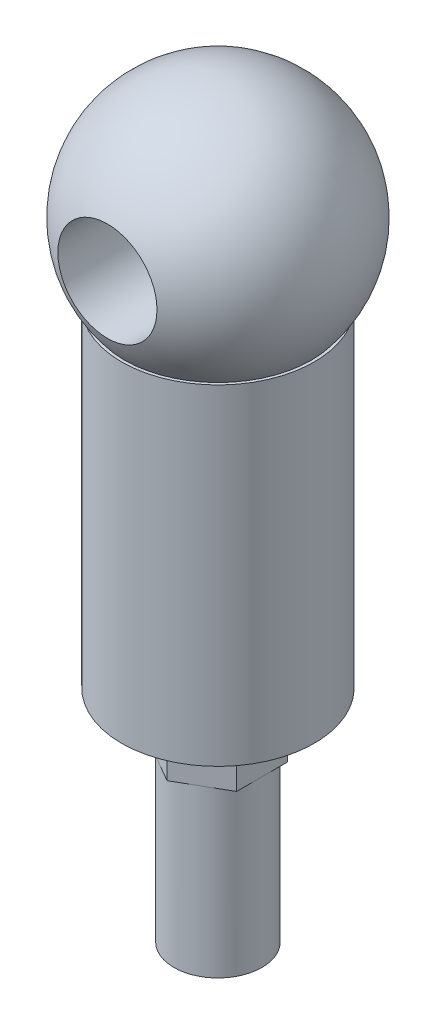
ISO-10303-21;
HEADER;
FILE_DESCRIPTION(('STEP AP214'),'2;1');
FILE_NAME('part.step','',(''),(''),'','','');
FILE_SCHEMA(('AUTOMOTIVE_DESIGN { 1 0 10303 214 1 1 1 1 }'));
ENDSEC;
DATA;
#1=APPLICATION_CONTEXT('core data for automotive mechanical design processes');
#2=APPLICATION_PROTOCOL_DEFINITION('international standard','automotive_design',2000,#1);
#3=PRODUCT_CONTEXT('',#1,'mechanical');
#4=PRODUCT('Part','Part','',(#3));
#5=PRODUCT_RELATED_PRODUCT_CATEGORY('part','',(#4));
#6=PRODUCT_DEFINITION_FORMATION('','',#4);
#7=PRODUCT_DEFINITION_CONTEXT('part definition',#1,'design');
#8=PRODUCT_DEFINITION('design','',#6,#7);
#9=PRODUCT_DEFINITION_SHAPE('','',#8);
#10=(LENGTH_UNIT() NAMED_UNIT(*) SI_UNIT(.MILLI.,.METRE.));
#11=(NAMED_UNIT(*) PLANE_ANGLE_UNIT() SI_UNIT($,.RADIAN.));
#12=(NAMED_UNIT(*) SI_UNIT($,.STERADIAN.) SOLID_ANGLE_UNIT());
#13=UNCERTAINTY_MEASURE_WITH_UNIT(LENGTH_MEASURE(1.E-05),#10,'distance_accuracy_value','');
#14=(GEOMETRIC_REPRESENTATION_CONTEXT(3) GLOBAL_UNCERTAINTY_ASSIGNED_CONTEXT((#13)) GLOBAL_UNIT_ASSIGNED_CONTEXT((#10,
#11,#12)) REPRESENTATION_CONTEXT('',''));
#15=CARTESIAN_POINT('',(0.,0.,0.));
#16=DIRECTION('',(0.,0.,1.));
#17=DIRECTION('',(1.,0.,0.));
#18=AXIS2_PLACEMENT_3D('',#15,#16,#17);
#19=CARTESIAN_POINT('',(0.,0.,0.));
#20=DIRECTION('',(0.,1.,0.));
#21=DIRECTION('',(0.,0.,1.));
#22=AXIS2_PLACEMENT_3D('',#19,#20,#21);
#23=PLANE('',#22);
#24=CARTESIAN_POINT('',(0.,0.,0.));
#25=DIRECTION('',(0.,-1.,0.));
#26=DIRECTION('',(0.,0.,-1.));
#27=AXIS2_PLACEMENT_3D('',#24,#25,#26);
#28=CIRCLE('',#27,4.);
#29=CARTESIAN_POINT('',(1.99999999999998,0.,-3.46410161513777));
#30=VERTEX_POINT('',#29);
#31=CARTESIAN_POINT('',(3.99999999999999,0.,0.));
#32=VERTEX_POINT('',#31);
#33=EDGE_CURVE('E47',#30,#32,#28,.T.);
#34=ORIENTED_EDGE('',*,*,#33,.F.);
#35=DIRECTION('',(-0.866025403784442,0.,-0.499999999999995));
#36=VECTOR('',#35,1.);
#37=CARTESIAN_POINT('',(3.99999999999997,0.,-2.30940107675855));
#38=LINE('',#37,#36);
#39=CARTESIAN_POINT('',(3.99999999999997,0.,-2.30940107675855));
#40=VERTEX_POINT('',#39);
#41=EDGE_CURVE('E113',#40,#30,#38,.T.);
#42=ORIENTED_EDGE('',*,*,#41,.F.);
#43=DIRECTION('',(0.,0.,-1.));
#44=VECTOR('',#43,1.);
#45=CARTESIAN_POINT('',(4.00000000000002,0.,2.30940107675846));
#46=LINE('',#45,#44);
#47=EDGE_CURVE('E129',#32,#40,#46,.T.);
#48=ORIENTED_EDGE('',*,*,#47,.F.);
#49=EDGE_LOOP('',(#34,#42,#48));
#50=FACE_BOUND('',#49,.T.);
#51=ADVANCED_FACE('F36',(#50),#23,.F.);
#52=CARTESIAN_POINT('',(2.00000000000003,0.,3.46410161513773));
#53=VERTEX_POINT('',#52);
#54=EDGE_CURVE('E11',#32,#53,#28,.T.);
#55=ORIENTED_EDGE('',*,*,#54,.F.);
#56=CARTESIAN_POINT('',(4.00000000000002,0.,2.30940107675846));
#57=VERTEX_POINT('',#56);
#58=EDGE_CURVE('E151',#57,#32,#46,.T.);
#59=ORIENTED_EDGE('',*,*,#58,.F.);
#60=DIRECTION('',(0.866025403784435,0.,-0.500000000000007));
#61=VECTOR('',#60,1.);
#62=CARTESIAN_POINT('',(0.,0.,4.618802153517));
#63=LINE('',#62,#61);
#64=EDGE_CURVE('E175',#53,#57,#63,.T.);
#65=ORIENTED_EDGE('',*,*,#64,.F.);
#66=EDGE_LOOP('',(#55,#59,#65));
#67=FACE_BOUND('',#66,.T.);
#68=ADVANCED_FACE('F215',(#67),#23,.F.);
#69=CARTESIAN_POINT('',(-1.99999999999998,0.,3.46410161513776));
#70=VERTEX_POINT('',#69);
#71=EDGE_CURVE('E45',#53,#70,#28,.T.);
#72=ORIENTED_EDGE('',*,*,#71,.F.);
#73=CARTESIAN_POINT('',(0.,0.,4.618802153517));
#74=VERTEX_POINT('',#73);
#75=EDGE_CURVE('E176',#74,#53,#63,.T.);
#76=ORIENTED_EDGE('',*,*,#75,.F.);
#77=DIRECTION('',(0.866025403784441,0.,0.499999999999995));
#78=VECTOR('',#77,1.);
#79=CARTESIAN_POINT('',(-3.99999999999998,0.,2.30940107675852));
#80=LINE('',#79,#78);
#81=EDGE_CURVE('E171',#70,#74,#80,.T.);
#82=ORIENTED_EDGE('',*,*,#81,.F.);
#83=EDGE_LOOP('',(#72,#76,#82));
#84=FACE_BOUND('',#83,.T.);
#85=ADVANCED_FACE('F220',(#84),#23,.F.);
#86=CARTESIAN_POINT('',(-3.99999999999999,0.,0.));
#87=VERTEX_POINT('',#86);
#88=EDGE_CURVE('E136',#70,#87,#28,.T.);
#89=ORIENTED_EDGE('',*,*,#88,.F.);
#90=CARTESIAN_POINT('',(-3.99999999999998,0.,2.30940107675852));
#91=VERTEX_POINT('',#90);
#92=EDGE_CURVE('E172',#91,#70,#80,.T.);
#93=ORIENTED_EDGE('',*,*,#92,.F.);
#94=DIRECTION('',(0.,0.,1.));
#95=VECTOR('',#94,1.);
#96=CARTESIAN_POINT('',(-4.,0.,-2.30940107675849));
#97=LINE('',#96,#95);
#98=EDGE_CURVE('E167',#87,#91,#97,.T.);
#99=ORIENTED_EDGE('',*,*,#98,.F.);
#100=EDGE_LOOP('',(#89,#93,#99));
#101=FACE_BOUND('',#100,.T.);
#102=ADVANCED_FACE('F238',(#101),#23,.F.);
#103=CARTESIAN_POINT('',(-2.,0.,-3.46410161513775));
#104=VERTEX_POINT('',#103);
#105=EDGE_CURVE('E61',#87,#104,#28,.T.);
#106=ORIENTED_EDGE('',*,*,#105,.F.);
#107=CARTESIAN_POINT('',(-4.,0.,-2.30940107675849));
#108=VERTEX_POINT('',#107);
#109=EDGE_CURVE('E168',#108,#87,#97,.T.);
#110=ORIENTED_EDGE('',*,*,#109,.F.);
#111=DIRECTION('',(-0.866025403784438,0.,0.500000000000001));
#112=VECTOR('',#111,1.);
#113=CARTESIAN_POINT('',(0.,0.,-4.618802153517));
#114=LINE('',#113,#112);
#115=EDGE_CURVE('E121',#104,#108,#114,.T.);
#116=ORIENTED_EDGE('',*,*,#115,.F.);
#117=EDGE_LOOP('',(#106,#110,#116));
#118=FACE_BOUND('',#117,.T.);
#119=ADVANCED_FACE('F227',(#118),#23,.F.);
#120=CARTESIAN_POINT('',(3.99999999999997,5.,-2.30940107675855));
#121=DIRECTION('',(-0.499999999999995,0.,0.866025403784442));
#122=DIRECTION('',(0.866025403784442,0.,0.499999999999995));
#123=AXIS2_PLACEMENT_3D('',#120,#121,#122);
#124=PLANE('',#123);
#125=ORIENTED_EDGE('',*,*,#41,.T.);
#126=CARTESIAN_POINT('',(0.,0.,-4.618802153517));
#127=VERTEX_POINT('',#126);
#128=EDGE_CURVE('E115',#30,#127,#38,.T.);
#129=ORIENTED_EDGE('',*,*,#128,.T.);
#130=DIRECTION('',(0.,-1.,0.));
#131=VECTOR('',#130,1.);
#132=CARTESIAN_POINT('',(0.,5.,-4.618802153517));
#133=LINE('',#132,#131);
#134=CARTESIAN_POINT('',(0.,5.,-4.618802153517));
#135=VERTEX_POINT('',#134);
#136=EDGE_CURVE('E135',#135,#127,#133,.T.);
#137=ORIENTED_EDGE('',*,*,#136,.F.);
#138=DIRECTION('',(-0.866025403784442,0.,-0.499999999999995));
#139=VECTOR('',#138,1.);
#140=CARTESIAN_POINT('',(3.99999999999997,5.,-2.30940107675855));
#141=LINE('',#140,#139);
#142=CARTESIAN_POINT('',(3.99999999999997,5.,-2.30940107675855));
#143=VERTEX_POINT('',#142);
#144=EDGE_CURVE('E147',#143,#135,#141,.T.);
#145=ORIENTED_EDGE('',*,*,#144,.F.);
#146=DIRECTION('',(0.,-1.,0.));
#147=VECTOR('',#146,1.);
#148=CARTESIAN_POINT('',(3.99999999999997,5.,-2.30940107675855));
#149=LINE('',#148,#147);
#150=EDGE_CURVE('E117',#143,#40,#149,.T.);
#151=ORIENTED_EDGE('',*,*,#150,.T.);
#152=EDGE_LOOP('',(#125,#129,#137,#145,#151));
#153=FACE_BOUND('',#152,.T.);
#154=ADVANCED_FACE('F38',(#153),#124,.F.);
#155=CARTESIAN_POINT('',(0.,5.,-4.618802153517));
#156=DIRECTION('',(0.500000000000001,0.,0.866025403784438));
#157=DIRECTION('',(0.866025403784438,0.,-0.500000000000001));
#158=AXIS2_PLACEMENT_3D('',#155,#156,#157);
#159=PLANE('',#158);
#160=EDGE_CURVE('E125',#127,#104,#114,.T.);
#161=ORIENTED_EDGE('',*,*,#160,.T.);
#162=ORIENTED_EDGE('',*,*,#115,.T.);
#163=DIRECTION('',(0.,-1.,0.));
#164=VECTOR('',#163,1.);
#165=CARTESIAN_POINT('',(-4.,5.,-2.30940107675849));
#166=LINE('',#165,#164);
#167=CARTESIAN_POINT('',(-4.,5.,-2.30940107675849));
#168=VERTEX_POINT('',#167);
#169=EDGE_CURVE('E137',#168,#108,#166,.T.);
#170=ORIENTED_EDGE('',*,*,#169,.F.);
#171=DIRECTION('',(-0.866025403784438,0.,0.500000000000001));
#172=VECTOR('',#171,1.);
#173=CARTESIAN_POINT('',(0.,5.,-4.618802153517));
#174=LINE('',#173,#172);
#175=EDGE_CURVE('E150',#135,#168,#174,.T.);
#176=ORIENTED_EDGE('',*,*,#175,.F.);
#177=ORIENTED_EDGE('',*,*,#136,.T.);
#178=EDGE_LOOP('',(#161,#162,#170,#176,#177));
#179=FACE_BOUND('',#178,.T.);
#180=ADVANCED_FACE('F243',(#179),#159,.F.);
#181=CARTESIAN_POINT('',(-4.,5.,-2.30940107675849));
#182=DIRECTION('',(1.,0.,0.));
#183=DIRECTION('',(0.,0.,-1.));
#184=AXIS2_PLACEMENT_3D('',#181,#182,#183);
#185=PLANE('',#184);
#186=ORIENTED_EDGE('',*,*,#109,.T.);
#187=ORIENTED_EDGE('',*,*,#98,.T.);
#188=DIRECTION('',(0.,-1.,0.));
#189=VECTOR('',#188,1.);
#190=CARTESIAN_POINT('',(-3.99999999999998,5.,2.30940107675852));
#191=LINE('',#190,#189);
#192=CARTESIAN_POINT('',(-3.99999999999998,5.,2.30940107675852));
#193=VERTEX_POINT('',#192);
#194=EDGE_CURVE('E187',#193,#91,#191,.T.);
#195=ORIENTED_EDGE('',*,*,#194,.F.);
#196=DIRECTION('',(0.,0.,1.));
#197=VECTOR('',#196,1.);
#198=CARTESIAN_POINT('',(-4.,5.,-2.30940107675849));
#199=LINE('',#198,#197);
#200=EDGE_CURVE('E154',#168,#193,#199,.T.);
#201=ORIENTED_EDGE('',*,*,#200,.F.);
#202=ORIENTED_EDGE('',*,*,#169,.T.);
#203=EDGE_LOOP('',(#186,#187,#195,#201,#202));
#204=FACE_BOUND('',#203,.T.);
#205=ADVANCED_FACE('F263',(#204),#185,.F.);
#206=CARTESIAN_POINT('',(-3.99999999999998,5.,2.30940107675852));
#207=DIRECTION('',(0.499999999999995,0.,-0.866025403784442));
#208=DIRECTION('',(-0.866025403784442,0.,-0.499999999999995));
#209=AXIS2_PLACEMENT_3D('',#206,#207,#208);
#210=PLANE('',#209);
#211=ORIENTED_EDGE('',*,*,#92,.T.);
#212=ORIENTED_EDGE('',*,*,#81,.T.);
#213=DIRECTION('',(0.,-1.,0.));
#214=VECTOR('',#213,1.);
#215=CARTESIAN_POINT('',(0.,5.,4.618802153517));
#216=LINE('',#215,#214);
#217=CARTESIAN_POINT('',(0.,5.,4.618802153517));
#218=VERTEX_POINT('',#217);
#219=EDGE_CURVE('E184',#218,#74,#216,.T.);
#220=ORIENTED_EDGE('',*,*,#219,.F.);
#221=DIRECTION('',(0.866025403784441,0.,0.499999999999995));
#222=VECTOR('',#221,1.);
#223=CARTESIAN_POINT('',(-3.99999999999998,5.,2.30940107675852));
#224=LINE('',#223,#222);
#225=EDGE_CURVE('E157',#193,#218,#224,.T.);
#226=ORIENTED_EDGE('',*,*,#225,.F.);
#227=ORIENTED_EDGE('',*,*,#194,.T.);
#228=EDGE_LOOP('',(#211,#212,#220,#226,#227));
#229=FACE_BOUND('',#228,.T.);
#230=ADVANCED_FACE('F255',(#229),#210,.F.);
#231=CARTESIAN_POINT('',(0.,5.,4.618802153517));
#232=DIRECTION('',(-0.500000000000007,0.,-0.866025403784434));
#233=DIRECTION('',(-0.866025403784435,0.,0.500000000000007));
#234=AXIS2_PLACEMENT_3D('',#231,#232,#233);
#235=PLANE('',#234);
#236=ORIENTED_EDGE('',*,*,#75,.T.);
#237=ORIENTED_EDGE('',*,*,#64,.T.);
#238=DIRECTION('',(0.,-1.,0.));
#239=VECTOR('',#238,1.);
#240=CARTESIAN_POINT('',(4.00000000000002,5.,2.30940107675846));
#241=LINE('',#240,#239);
#242=CARTESIAN_POINT('',(4.00000000000002,5.,2.30940107675846));
#243=VERTEX_POINT('',#242);
#244=EDGE_CURVE('E181',#243,#57,#241,.T.);
#245=ORIENTED_EDGE('',*,*,#244,.F.);
#246=DIRECTION('',(0.866025403784435,0.,-0.500000000000007));
#247=VECTOR('',#246,1.);
#248=CARTESIAN_POINT('',(0.,5.,4.618802153517));
#249=LINE('',#248,#247);
#250=EDGE_CURVE('E160',#218,#243,#249,.T.);
#251=ORIENTED_EDGE('',*,*,#250,.F.);
#252=ORIENTED_EDGE('',*,*,#219,.T.);
#253=EDGE_LOOP('',(#236,#237,#245,#251,#252));
#254=FACE_BOUND('',#253,.T.);
#255=ADVANCED_FACE('F235',(#254),#235,.F.);
#256=CARTESIAN_POINT('',(4.00000000000002,5.,2.30940107675846));
#257=DIRECTION('',(-1.,0.,0.));
#258=DIRECTION('',(0.,0.,1.));
#259=AXIS2_PLACEMENT_3D('',#256,#257,#258);
#260=PLANE('',#259);
#261=ORIENTED_EDGE('',*,*,#58,.T.);
#262=ORIENTED_EDGE('',*,*,#47,.T.);
#263=ORIENTED_EDGE('',*,*,#150,.F.);
#264=DIRECTION('',(0.,0.,-1.));
#265=VECTOR('',#264,1.);
#266=CARTESIAN_POINT('',(4.00000000000002,5.,2.30940107675846));
#267=LINE('',#266,#265);
#268=EDGE_CURVE('E163',#243,#143,#267,.T.);
#269=ORIENTED_EDGE('',*,*,#268,.F.);
#270=ORIENTED_EDGE('',*,*,#244,.T.);
#271=EDGE_LOOP('',(#261,#262,#263,#269,#270));
#272=FACE_BOUND('',#271,.T.);
#273=ADVANCED_FACE('F226',(#272),#260,.F.);
#274=EDGE_CURVE('E54',#104,#30,#28,.T.);
#275=ORIENTED_EDGE('',*,*,#274,.F.);
#276=ORIENTED_EDGE('',*,*,#160,.F.);
#277=ORIENTED_EDGE('',*,*,#128,.F.);
#278=EDGE_LOOP('',(#275,#276,#277));
#279=FACE_BOUND('',#278,.T.);
#280=ADVANCED_FACE('F123',(#279),#23,.F.);
#281=CARTESIAN_POINT('',(0.,5.,0.));
#282=DIRECTION('',(0.,1.,0.));
#283=DIRECTION('',(0.,0.,1.));
#284=AXIS2_PLACEMENT_3D('',#281,#282,#283);
#285=PLANE('',#284);
#286=CARTESIAN_POINT('',(0.,5.,0.));
#287=DIRECTION('',(0.,1.,0.));
#288=DIRECTION('',(0.,0.,1.));
#289=AXIS2_PLACEMENT_3D('',#286,#287,#288);
#290=CIRCLE('',#289,8.75);
#291=CARTESIAN_POINT('',(0.,5.,8.75));
#292=VERTEX_POINT('',#291);
#293=EDGE_CURVE('E143',#292,#292,#290,.T.);
#294=ORIENTED_EDGE('',*,*,#293,.F.);
#295=EDGE_LOOP('',(#294));
#296=FACE_BOUND('',#295,.T.);
#297=ORIENTED_EDGE('',*,*,#268,.T.);
#298=ORIENTED_EDGE('',*,*,#144,.T.);
#299=ORIENTED_EDGE('',*,*,#175,.T.);
#300=ORIENTED_EDGE('',*,*,#200,.T.);
#301=ORIENTED_EDGE('',*,*,#225,.T.);
#302=ORIENTED_EDGE('',*,*,#250,.T.);
#303=EDGE_LOOP('',(#297,#298,#299,#300,#301,#302));
#304=FACE_BOUND('',#303,.T.);
#305=ADVANCED_FACE('F225',(#296,#304),#285,.F.);
#306=CARTESIAN_POINT('',(0.,35.,0.));
#307=DIRECTION('',(0.,-1.,0.));
#308=DIRECTION('',(0.,0.,-1.));
#309=AXIS2_PLACEMENT_3D('',#306,#307,#308);
#310=CYLINDRICAL_SURFACE('',#309,8.75);
#311=CARTESIAN_POINT('',(0.,35.,0.));
#312=DIRECTION('',(0.,1.,0.));
#313=DIRECTION('',(0.,0.,1.));
#314=AXIS2_PLACEMENT_3D('',#311,#312,#313);
#315=CIRCLE('',#314,8.75);
#316=CARTESIAN_POINT('',(0.,35.,8.75));
#317=VERTEX_POINT('',#316);
#318=EDGE_CURVE('E127',#317,#317,#315,.T.);
#319=ORIENTED_EDGE('',*,*,#318,.F.);
#320=EDGE_LOOP('',(#319));
#321=FACE_BOUND('',#320,.T.);
#322=ORIENTED_EDGE('',*,*,#293,.T.);
#323=EDGE_LOOP('',(#322));
#324=FACE_BOUND('',#323,.T.);
#325=ADVANCED_FACE('F232',(#321,#324),#310,.T.);
#326=CARTESIAN_POINT('',(0.,35.,0.));
#327=DIRECTION('',(0.,1.,0.));
#328=DIRECTION('',(0.,0.,1.));
#329=AXIS2_PLACEMENT_3D('',#326,#327,#328);
#330=PLANE('',#329);
#331=CARTESIAN_POINT('',(0.,35.,0.));
#332=DIRECTION('',(0.,1.,0.));
#333=DIRECTION('',(0.,0.,1.));
#334=AXIS2_PLACEMENT_3D('',#331,#332,#333);
#335=CIRCLE('',#334,8.48528137423857);
#336=CARTESIAN_POINT('',(0.,35.,8.48528137423857));
#337=VERTEX_POINT('',#336);
#338=EDGE_CURVE('E146',#337,#337,#335,.F.);
#339=ORIENTED_EDGE('',*,*,#338,.T.);
#340=EDGE_LOOP('',(#339));
#341=FACE_BOUND('',#340,.T.);
#342=ORIENTED_EDGE('',*,*,#318,.T.);
#343=EDGE_LOOP('',(#342));
#344=FACE_BOUND('',#343,.T.);
#345=ADVANCED_FACE('F336',(#341,#344),#330,.T.);
#346=CARTESIAN_POINT('',(0.,42.,0.));
#347=DIRECTION('',(0.,1.,0.));
#348=DIRECTION('',(1.,0.,0.));
#349=AXIS2_PLACEMENT_3D('',#346,#347,#348);
#350=SPHERICAL_SURFACE('',#349,11.);
#351=CARTESIAN_POINT('',(0.,42.,10.0374299499424));
#352=DIRECTION('',(0.,0.,-1.));
#353=DIRECTION('',(-1.,0.,0.));
#354=AXIS2_PLACEMENT_3D('',#351,#352,#353);
#355=CIRCLE('',#354,4.5);
#356=CARTESIAN_POINT('',(-4.5,42.,10.0374299499424));
#357=VERTEX_POINT('',#356);
#358=EDGE_CURVE('E40',#357,#357,#355,.T.);
#359=ORIENTED_EDGE('',*,*,#358,.T.);
#360=EDGE_LOOP('',(#359));
#361=FACE_BOUND('',#360,.T.);
#362=CARTESIAN_POINT('',(0.,42.,-10.0374299499424));
#363=DIRECTION('',(0.,0.,1.));
#364=DIRECTION('',(1.,0.,0.));
#365=AXIS2_PLACEMENT_3D('',#362,#363,#364);
#366=CIRCLE('',#365,4.5);
#367=CARTESIAN_POINT('',(4.5,42.,-10.0374299499424));
#368=VERTEX_POINT('',#367);
#369=EDGE_CURVE('E193',#368,#368,#366,.T.);
#370=ORIENTED_EDGE('',*,*,#369,.T.);
#371=EDGE_LOOP('',(#370));
#372=FACE_BOUND('',#371,.T.);
#373=ORIENTED_EDGE('',*,*,#338,.F.);
#374=EDGE_LOOP('',(#373));
#375=FACE_BOUND('',#374,.T.);
#376=ADVANCED_FACE('F211',(#361,#372,#375),#350,.T.);
#377=CARTESIAN_POINT('',(0.,42.,-25.));
#378=DIRECTION('',(0.,0.,1.));
#379=DIRECTION('',(1.,0.,0.));
#380=AXIS2_PLACEMENT_3D('',#377,#378,#379);
#381=CYLINDRICAL_SURFACE('',#380,4.5);
#382=ORIENTED_EDGE('',*,*,#369,.F.);
#383=EDGE_LOOP('',(#382));
#384=FACE_BOUND('',#383,.T.);
#385=ORIENTED_EDGE('',*,*,#358,.F.);
#386=EDGE_LOOP('',(#385));
#387=FACE_BOUND('',#386,.T.);
#388=ADVANCED_FACE('F204',(#384,#387),#381,.F.);
#389=CARTESIAN_POINT('',(0.,-15.,0.));
#390=DIRECTION('',(0.,1.,0.));
#391=DIRECTION('',(0.,0.,1.));
#392=AXIS2_PLACEMENT_3D('',#389,#390,#391);
#393=CYLINDRICAL_SURFACE('',#392,4.);
#394=CARTESIAN_POINT('',(0.,-15.,0.));
#395=DIRECTION('',(0.,-1.,0.));
#396=DIRECTION('',(0.,0.,-1.));
#397=AXIS2_PLACEMENT_3D('',#394,#395,#396);
#398=CIRCLE('',#397,4.);
#399=CARTESIAN_POINT('',(0.,-15.,-4.));
#400=VERTEX_POINT('',#399);
#401=EDGE_CURVE('E132',#400,#400,#398,.T.);
#402=ORIENTED_EDGE('',*,*,#401,.F.);
#403=EDGE_LOOP('',(#402));
#404=FACE_BOUND('',#403,.T.);
#405=ORIENTED_EDGE('',*,*,#33,.T.);
#406=ORIENTED_EDGE('',*,*,#54,.T.);
#407=ORIENTED_EDGE('',*,*,#71,.T.);
#408=ORIENTED_EDGE('',*,*,#88,.T.);
#409=ORIENTED_EDGE('',*,*,#105,.T.);
#410=ORIENTED_EDGE('',*,*,#274,.T.);
#411=EDGE_LOOP('',(#405,#406,#407,#408,#409,#410));
#412=FACE_BOUND('',#411,.T.);
#413=ADVANCED_FACE('F133',(#404,#412),#393,.T.);
#414=CARTESIAN_POINT('',(0.,-15.,0.));
#415=DIRECTION('',(0.,-1.,0.));
#416=DIRECTION('',(0.,0.,-1.));
#417=AXIS2_PLACEMENT_3D('',#414,#415,#416);
#418=PLANE('',#417);
#419=ORIENTED_EDGE('',*,*,#401,.T.);
#420=EDGE_LOOP('',(#419));
#421=FACE_BOUND('',#420,.T.);
#422=ADVANCED_FACE('F201',(#421),#418,.T.);
#423=CLOSED_SHELL('',(#51,#68,#85,#102,#119,#154,#180,#205,#230,#255,#273,#280,#305,#325,#345,
#376,#388,#413,#422));
#424=MANIFOLD_SOLID_BREP('B2',#423);
#425=ADVANCED_BREP_SHAPE_REPRESENTATION('',(#18,#424),#14);
#426=SHAPE_DEFINITION_REPRESENTATION(#9,#425);
ENDSEC;
END-ISO-10303-21;
